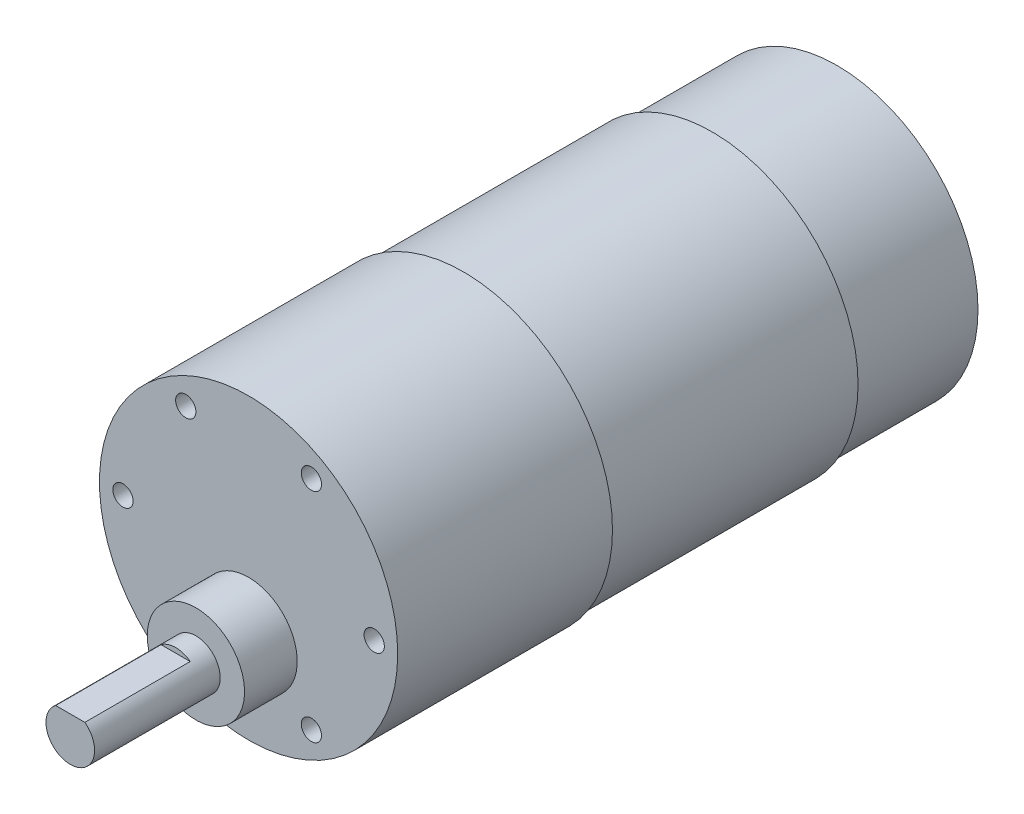
ISO-10303-21;
HEADER;
FILE_DESCRIPTION(('STEP AP214'),'2;1');
FILE_NAME('part.step','',(''),(''),'','','');
FILE_SCHEMA(('AUTOMOTIVE_DESIGN { 1 0 10303 214 1 1 1 1 }'));
ENDSEC;
DATA;
#1=APPLICATION_CONTEXT('core data for automotive mechanical design processes');
#2=APPLICATION_PROTOCOL_DEFINITION('international standard','automotive_design',2000,#1);
#3=PRODUCT_CONTEXT('',#1,'mechanical');
#4=PRODUCT('Part','Part','',(#3));
#5=PRODUCT_RELATED_PRODUCT_CATEGORY('part','',(#4));
#6=PRODUCT_DEFINITION_FORMATION('','',#4);
#7=PRODUCT_DEFINITION_CONTEXT('part definition',#1,'design');
#8=PRODUCT_DEFINITION('design','',#6,#7);
#9=PRODUCT_DEFINITION_SHAPE('','',#8);
#10=(LENGTH_UNIT() NAMED_UNIT(*) SI_UNIT(.MILLI.,.METRE.));
#11=(NAMED_UNIT(*) PLANE_ANGLE_UNIT() SI_UNIT($,.RADIAN.));
#12=(NAMED_UNIT(*) SI_UNIT($,.STERADIAN.) SOLID_ANGLE_UNIT());
#13=UNCERTAINTY_MEASURE_WITH_UNIT(LENGTH_MEASURE(1.E-05),#10,'distance_accuracy_value','');
#14=(GEOMETRIC_REPRESENTATION_CONTEXT(3) GLOBAL_UNCERTAINTY_ASSIGNED_CONTEXT((#13)) GLOBAL_UNIT_ASSIGNED_CONTEXT((#10,
#11,#12)) REPRESENTATION_CONTEXT('',''));
#15=CARTESIAN_POINT('',(0.,0.,0.));
#16=DIRECTION('',(0.,0.,1.));
#17=DIRECTION('',(1.,0.,0.));
#18=AXIS2_PLACEMENT_3D('',#15,#16,#17);
#19=CARTESIAN_POINT('',(0.,0.,15.4));
#20=DIRECTION('',(0.,0.,-1.));
#21=DIRECTION('',(-1.,0.,0.));
#22=AXIS2_PLACEMENT_3D('',#19,#20,#21);
#23=CYLINDRICAL_SURFACE('',#22,17.4);
#24=CARTESIAN_POINT('',(0.,0.,15.4));
#25=DIRECTION('',(0.,0.,1.));
#26=DIRECTION('',(1.,0.,0.));
#27=AXIS2_PLACEMENT_3D('',#24,#25,#26);
#28=CIRCLE('',#27,17.4);
#29=CARTESIAN_POINT('',(-17.4,0.,15.4));
#30=VERTEX_POINT('',#29);
#31=EDGE_CURVE('E11',#30,#30,#28,.T.);
#32=CARTESIAN_POINT('',(0.,0.,0.));
#33=DIRECTION('',(0.,0.,1.));
#34=DIRECTION('',(1.,0.,0.));
#35=AXIS2_PLACEMENT_3D('',#32,#33,#34);
#36=CIRCLE('',#35,17.4);
#37=CARTESIAN_POINT('',(-17.4,0.,0.));
#38=VERTEX_POINT('',#37);
#39=EDGE_CURVE('E45',#38,#38,#36,.T.);
#40=CARTESIAN_POINT('',(-17.4,0.,15.4));
#41=CARTESIAN_POINT('',(-17.4,0.,15.2395833333333));
#42=CARTESIAN_POINT('',(-17.4,0.,15.0791666666667));
#43=CARTESIAN_POINT('',(-17.4,0.,14.7583333333333));
#44=CARTESIAN_POINT('',(-17.4,0.,14.5979166666667));
#45=CARTESIAN_POINT('',(-17.4,0.,14.2770833333333));
#46=CARTESIAN_POINT('',(-17.4,0.,14.1166666666667));
#47=CARTESIAN_POINT('',(-17.4,0.,13.7958333333333));
#48=CARTESIAN_POINT('',(-17.4,0.,13.6354166666667));
#49=CARTESIAN_POINT('',(-17.4,0.,13.3145833333333));
#50=CARTESIAN_POINT('',(-17.4,0.,13.1541666666667));
#51=CARTESIAN_POINT('',(-17.4,0.,12.8333333333333));
#52=CARTESIAN_POINT('',(-17.4,0.,12.6729166666667));
#53=CARTESIAN_POINT('',(-17.4,0.,12.3520833333333));
#54=CARTESIAN_POINT('',(-17.4,0.,12.1916666666667));
#55=CARTESIAN_POINT('',(-17.4,0.,11.8708333333333));
#56=CARTESIAN_POINT('',(-17.4,0.,11.7104166666667));
#57=CARTESIAN_POINT('',(-17.4,0.,11.3895833333333));
#58=CARTESIAN_POINT('',(-17.4,0.,11.2291666666667));
#59=CARTESIAN_POINT('',(-17.4,0.,10.9083333333333));
#60=CARTESIAN_POINT('',(-17.4,0.,10.7479166666667));
#61=CARTESIAN_POINT('',(-17.4,0.,10.4270833333333));
#62=CARTESIAN_POINT('',(-17.4,0.,10.2666666666667));
#63=CARTESIAN_POINT('',(-17.4,0.,9.94583333333333));
#64=CARTESIAN_POINT('',(-17.4,0.,9.78541666666666));
#65=CARTESIAN_POINT('',(-17.4,0.,9.46458333333333));
#66=CARTESIAN_POINT('',(-17.4,0.,9.30416666666667));
#67=CARTESIAN_POINT('',(-17.4,0.,8.98333333333333));
#68=CARTESIAN_POINT('',(-17.4,0.,8.82291666666666));
#69=CARTESIAN_POINT('',(-17.4,0.,8.50208333333333));
#70=CARTESIAN_POINT('',(-17.4,0.,8.34166666666666));
#71=CARTESIAN_POINT('',(-17.4,0.,8.02083333333333));
#72=CARTESIAN_POINT('',(-17.4,0.,7.86041666666666));
#73=CARTESIAN_POINT('',(-17.4,0.,7.53958333333333));
#74=CARTESIAN_POINT('',(-17.4,0.,7.37916666666667));
#75=CARTESIAN_POINT('',(-17.4,0.,7.05833333333333));
#76=CARTESIAN_POINT('',(-17.4,0.,6.89791666666667));
#77=CARTESIAN_POINT('',(-17.4,0.,6.57708333333333));
#78=CARTESIAN_POINT('',(-17.4,0.,6.41666666666667));
#79=CARTESIAN_POINT('',(-17.4,0.,6.09583333333333));
#80=CARTESIAN_POINT('',(-17.4,0.,5.93541666666667));
#81=CARTESIAN_POINT('',(-17.4,0.,5.61458333333333));
#82=CARTESIAN_POINT('',(-17.4,0.,5.45416666666667));
#83=CARTESIAN_POINT('',(-17.4,0.,5.13333333333333));
#84=CARTESIAN_POINT('',(-17.4,0.,4.97291666666667));
#85=CARTESIAN_POINT('',(-17.4,0.,4.65208333333333));
#86=CARTESIAN_POINT('',(-17.4,0.,4.49166666666667));
#87=CARTESIAN_POINT('',(-17.4,0.,4.17083333333333));
#88=CARTESIAN_POINT('',(-17.4,0.,4.01041666666667));
#89=CARTESIAN_POINT('',(-17.4,0.,3.68958333333333));
#90=CARTESIAN_POINT('',(-17.4,0.,3.52916666666667));
#91=CARTESIAN_POINT('',(-17.4,0.,3.20833333333333));
#92=CARTESIAN_POINT('',(-17.4,0.,3.04791666666667));
#93=CARTESIAN_POINT('',(-17.4,0.,2.72708333333333));
#94=CARTESIAN_POINT('',(-17.4,0.,2.56666666666667));
#95=CARTESIAN_POINT('',(-17.4,0.,2.24583333333333));
#96=CARTESIAN_POINT('',(-17.4,0.,2.08541666666666));
#97=CARTESIAN_POINT('',(-17.4,0.,1.76458333333333));
#98=CARTESIAN_POINT('',(-17.4,0.,1.60416666666667));
#99=CARTESIAN_POINT('',(-17.4,0.,1.28333333333333));
#100=CARTESIAN_POINT('',(-17.4,0.,1.12291666666666));
#101=CARTESIAN_POINT('',(-17.4,0.,0.802083333333332));
#102=CARTESIAN_POINT('',(-17.4,0.,0.641666666666665));
#103=CARTESIAN_POINT('',(-17.4,0.,0.320833333333332));
#104=CARTESIAN_POINT('',(-17.4,0.,0.160416666666665));
#105=CARTESIAN_POINT('',(-17.4,0.,0.));
#106=B_SPLINE_CURVE_WITH_KNOTS('',3,(#40,#41,#42,#43,#44,#45,#46,#47,#48,#49,#50,#51,#52,#53,
#54,#55,#56,#57,#58,#59,#60,#61,#62,#63,#64,#65,#66,#67,#68,#69,#70,#71,#72,#73,#74,#75,#76,#77,
#78,#79,#80,#81,#82,#83,#84,#85,#86,#87,#88,#89,#90,#91,#92,#93,#94,#95,#96,#97,#98,#99,#100,
#101,#102,#103,#104,#105),.UNSPECIFIED.,.F.,.F.,(4,2,2,2,2,2,2,2,2,2,2,2,2,2,2,2,2,2,2,2,2,2,2,
2,2,2,2,2,2,2,2,2,4),(0.,0.481250000000001,0.962500000000002,1.44375,1.925,2.40625,2.8875,
3.36875,3.85,4.33125,4.8125,5.29375,5.775,6.25625,6.7375,7.21875,7.7,8.18125,8.6625,9.14375,
9.625,10.10625,10.5875,11.06875,11.55,12.03125,12.5125,12.99375,13.475,13.95625,14.4375,
14.91875,15.4),.UNSPECIFIED.);
#107=EDGE_CURVE('BSEAM42',#30,#38,#106,.T.);
#108=ORIENTED_EDGE('',*,*,#31,.F.);
#109=ORIENTED_EDGE('',*,*,#39,.T.);
#110=ORIENTED_EDGE('',*,*,#107,.T.);
#111=ORIENTED_EDGE('',*,*,#107,.F.);
#112=EDGE_LOOP('',(#108,#110,#109,#111));
#113=FACE_BOUND('',#112,.T.);
#114=ADVANCED_FACE('F42',(#113),#23,.T.);
#115=CARTESIAN_POINT('',(0.,0.,0.));
#116=DIRECTION('',(0.,0.,1.));
#117=DIRECTION('',(1.,0.,0.));
#118=AXIS2_PLACEMENT_3D('',#115,#116,#117);
#119=PLANE('',#118);
#120=ORIENTED_EDGE('',*,*,#39,.F.);
#121=EDGE_LOOP('',(#120));
#122=FACE_BOUND('',#121,.T.);
#123=ADVANCED_FACE('F138',(#122),#119,.F.);
#124=CARTESIAN_POINT('',(0.,0.,46.1));
#125=DIRECTION('',(0.,0.,-1.));
#126=DIRECTION('',(-1.,0.,0.));
#127=AXIS2_PLACEMENT_3D('',#124,#125,#126);
#128=CYLINDRICAL_SURFACE('',#127,18.);
#129=CARTESIAN_POINT('',(0.,0.,46.1));
#130=DIRECTION('',(0.,0.,1.));
#131=DIRECTION('',(1.,0.,0.));
#132=AXIS2_PLACEMENT_3D('',#129,#130,#131);
#133=CIRCLE('',#132,18.);
#134=CARTESIAN_POINT('',(18.,0.,46.1));
#135=VERTEX_POINT('',#134);
#136=EDGE_CURVE('E115',#135,#135,#133,.T.);
#137=ORIENTED_EDGE('',*,*,#136,.F.);
#138=EDGE_LOOP('',(#137));
#139=FACE_BOUND('',#138,.T.);
#140=CARTESIAN_POINT('',(0.,0.,15.4));
#141=DIRECTION('',(0.,0.,1.));
#142=DIRECTION('',(1.,0.,0.));
#143=AXIS2_PLACEMENT_3D('',#140,#141,#142);
#144=CIRCLE('',#143,18.);
#145=CARTESIAN_POINT('',(18.,0.,15.4));
#146=VERTEX_POINT('',#145);
#147=EDGE_CURVE('E111',#146,#146,#144,.T.);
#148=ORIENTED_EDGE('',*,*,#147,.T.);
#149=EDGE_LOOP('',(#148));
#150=FACE_BOUND('',#149,.T.);
#151=ADVANCED_FACE('F124',(#139,#150),#128,.T.);
#152=CARTESIAN_POINT('',(0.,0.,15.4));
#153=DIRECTION('',(0.,0.,1.));
#154=DIRECTION('',(1.,0.,0.));
#155=AXIS2_PLACEMENT_3D('',#152,#153,#154);
#156=PLANE('',#155);
#157=ORIENTED_EDGE('',*,*,#31,.T.);
#158=EDGE_LOOP('',(#157));
#159=FACE_BOUND('',#158,.T.);
#160=ORIENTED_EDGE('',*,*,#147,.F.);
#161=EDGE_LOOP('',(#160));
#162=FACE_BOUND('',#161,.T.);
#163=ADVANCED_FACE('F126',(#159,#162),#156,.F.);
#164=CARTESIAN_POINT('',(0.,0.,72.6));
#165=DIRECTION('',(0.,0.,-1.));
#166=DIRECTION('',(-1.,0.,0.));
#167=AXIS2_PLACEMENT_3D('',#164,#165,#166);
#168=CYLINDRICAL_SURFACE('',#167,18.4);
#169=CARTESIAN_POINT('',(0.,0.,72.6));
#170=DIRECTION('',(0.,0.,1.));
#171=DIRECTION('',(1.,0.,0.));
#172=AXIS2_PLACEMENT_3D('',#169,#170,#171);
#173=CIRCLE('',#172,18.4);
#174=CARTESIAN_POINT('',(18.4,0.,72.6));
#175=VERTEX_POINT('',#174);
#176=EDGE_CURVE('E107',#175,#175,#173,.T.);
#177=ORIENTED_EDGE('',*,*,#176,.F.);
#178=EDGE_LOOP('',(#177));
#179=FACE_BOUND('',#178,.T.);
#180=CARTESIAN_POINT('',(0.,0.,46.1));
#181=DIRECTION('',(0.,0.,1.));
#182=DIRECTION('',(1.,0.,0.));
#183=AXIS2_PLACEMENT_3D('',#180,#181,#182);
#184=CIRCLE('',#183,18.4);
#185=CARTESIAN_POINT('',(18.4,0.,46.1));
#186=VERTEX_POINT('',#185);
#187=EDGE_CURVE('E105',#186,#186,#184,.T.);
#188=ORIENTED_EDGE('',*,*,#187,.T.);
#189=EDGE_LOOP('',(#188));
#190=FACE_BOUND('',#189,.T.);
#191=ADVANCED_FACE('F128',(#179,#190),#168,.T.);
#192=CARTESIAN_POINT('',(0.,0.,72.6));
#193=DIRECTION('',(0.,0.,1.));
#194=DIRECTION('',(1.,0.,0.));
#195=AXIS2_PLACEMENT_3D('',#192,#193,#194);
#196=PLANE('',#195);
#197=CARTESIAN_POINT('',(-15.5,0.,72.6));
#198=DIRECTION('',(0.,0.,1.));
#199=DIRECTION('',(1.,0.,0.));
#200=AXIS2_PLACEMENT_3D('',#197,#198,#199);
#201=CIRCLE('',#200,1.25);
#202=CARTESIAN_POINT('',(-14.25,0.,72.6));
#203=VERTEX_POINT('',#202);
#204=EDGE_CURVE('E166',#203,#203,#201,.T.);
#205=ORIENTED_EDGE('',*,*,#204,.F.);
#206=EDGE_LOOP('',(#205));
#207=FACE_BOUND('',#206,.T.);
#208=CARTESIAN_POINT('',(-7.74999999999997,13.4233937586588,72.6));
#209=DIRECTION('',(0.,0.,1.));
#210=DIRECTION('',(1.,0.,0.));
#211=AXIS2_PLACEMENT_3D('',#208,#209,#210);
#212=CIRCLE('',#211,1.25);
#213=CARTESIAN_POINT('',(-6.49999999999997,13.4233937586588,72.6));
#214=VERTEX_POINT('',#213);
#215=EDGE_CURVE('E153',#214,#214,#212,.T.);
#216=ORIENTED_EDGE('',*,*,#215,.F.);
#217=EDGE_LOOP('',(#216));
#218=FACE_BOUND('',#217,.T.);
#219=CARTESIAN_POINT('',(7.75000000000006,13.4233937586588,72.6));
#220=DIRECTION('',(0.,0.,1.));
#221=DIRECTION('',(1.,0.,0.));
#222=AXIS2_PLACEMENT_3D('',#219,#220,#221);
#223=CIRCLE('',#222,1.25);
#224=CARTESIAN_POINT('',(9.00000000000006,13.4233937586588,72.6));
#225=VERTEX_POINT('',#224);
#226=EDGE_CURVE('E162',#225,#225,#223,.T.);
#227=ORIENTED_EDGE('',*,*,#226,.F.);
#228=EDGE_LOOP('',(#227));
#229=FACE_BOUND('',#228,.T.);
#230=CARTESIAN_POINT('',(15.5,-1.08235921504137E-13,72.6));
#231=DIRECTION('',(0.,0.,1.));
#232=DIRECTION('',(1.,0.,0.));
#233=AXIS2_PLACEMENT_3D('',#230,#231,#232);
#234=CIRCLE('',#233,1.25);
#235=CARTESIAN_POINT('',(16.75,-1.08235921504137E-13,72.6));
#236=VERTEX_POINT('',#235);
#237=EDGE_CURVE('E176',#236,#236,#234,.T.);
#238=ORIENTED_EDGE('',*,*,#237,.F.);
#239=EDGE_LOOP('',(#238));
#240=FACE_BOUND('',#239,.T.);
#241=CARTESIAN_POINT('',(7.74999999999987,-13.4233937586589,72.6));
#242=DIRECTION('',(0.,0.,1.));
#243=DIRECTION('',(1.,0.,0.));
#244=AXIS2_PLACEMENT_3D('',#241,#242,#243);
#245=CIRCLE('',#244,1.25);
#246=CARTESIAN_POINT('',(8.99999999999987,-13.4233937586589,72.6));
#247=VERTEX_POINT('',#246);
#248=EDGE_CURVE('E184',#247,#247,#245,.T.);
#249=ORIENTED_EDGE('',*,*,#248,.F.);
#250=EDGE_LOOP('',(#249));
#251=FACE_BOUND('',#250,.T.);
#252=CARTESIAN_POINT('',(-7.75000000000016,-13.4233937586587,72.6));
#253=DIRECTION('',(0.,0.,1.));
#254=DIRECTION('',(1.,0.,0.));
#255=AXIS2_PLACEMENT_3D('',#252,#253,#254);
#256=CIRCLE('',#255,1.25);
#257=CARTESIAN_POINT('',(-6.50000000000016,-13.4233937586587,72.6));
#258=VERTEX_POINT('',#257);
#259=EDGE_CURVE('E192',#258,#258,#256,.T.);
#260=ORIENTED_EDGE('',*,*,#259,.F.);
#261=EDGE_LOOP('',(#260));
#262=FACE_BOUND('',#261,.T.);
#263=CARTESIAN_POINT('',(0.,-7.,72.6));
#264=DIRECTION('',(0.,0.,1.));
#265=DIRECTION('',(1.,0.,0.));
#266=AXIS2_PLACEMENT_3D('',#263,#264,#265);
#267=CIRCLE('',#266,6.);
#268=CARTESIAN_POINT('',(-6.,-7.,72.6));
#269=VERTEX_POINT('',#268);
#270=EDGE_CURVE('E91',#269,#269,#267,.T.);
#271=ORIENTED_EDGE('',*,*,#270,.F.);
#272=EDGE_LOOP('',(#271));
#273=FACE_BOUND('',#272,.T.);
#274=ORIENTED_EDGE('',*,*,#176,.T.);
#275=EDGE_LOOP('',(#274));
#276=FACE_BOUND('',#275,.T.);
#277=ADVANCED_FACE('F135',(#207,#218,#229,#240,#251,#262,#273,#276),#196,.T.);
#278=CARTESIAN_POINT('',(0.,0.,46.1));
#279=DIRECTION('',(0.,0.,1.));
#280=DIRECTION('',(1.,0.,0.));
#281=AXIS2_PLACEMENT_3D('',#278,#279,#280);
#282=PLANE('',#281);
#283=ORIENTED_EDGE('',*,*,#136,.T.);
#284=EDGE_LOOP('',(#283));
#285=FACE_BOUND('',#284,.T.);
#286=ORIENTED_EDGE('',*,*,#187,.F.);
#287=EDGE_LOOP('',(#286));
#288=FACE_BOUND('',#287,.T.);
#289=ADVANCED_FACE('F229',(#285,#288),#282,.F.);
#290=CARTESIAN_POINT('',(0.,-7.,79.1));
#291=DIRECTION('',(0.,0.,-1.));
#292=DIRECTION('',(-1.,0.,0.));
#293=AXIS2_PLACEMENT_3D('',#290,#291,#292);
#294=CYLINDRICAL_SURFACE('',#293,6.);
#295=CARTESIAN_POINT('',(0.,-7.,79.1));
#296=DIRECTION('',(0.,0.,1.));
#297=DIRECTION('',(1.,0.,0.));
#298=AXIS2_PLACEMENT_3D('',#295,#296,#297);
#299=CIRCLE('',#298,6.);
#300=CARTESIAN_POINT('',(-6.,-7.,79.1));
#301=VERTEX_POINT('',#300);
#302=EDGE_CURVE('E96',#301,#301,#299,.T.);
#303=CARTESIAN_POINT('',(-6.,-7.,79.1));
#304=CARTESIAN_POINT('',(-6.,-7.,79.0322916666667));
#305=CARTESIAN_POINT('',(-6.,-7.,78.9645833333333));
#306=CARTESIAN_POINT('',(-6.,-7.,78.8291666666667));
#307=CARTESIAN_POINT('',(-6.,-7.,78.7614583333333));
#308=CARTESIAN_POINT('',(-6.,-7.,78.6260416666667));
#309=CARTESIAN_POINT('',(-6.,-7.,78.5583333333333));
#310=CARTESIAN_POINT('',(-6.,-7.,78.4229166666667));
#311=CARTESIAN_POINT('',(-6.,-7.,78.3552083333333));
#312=CARTESIAN_POINT('',(-6.,-7.,78.2197916666667));
#313=CARTESIAN_POINT('',(-6.,-7.,78.1520833333333));
#314=CARTESIAN_POINT('',(-6.,-7.,78.0166666666667));
#315=CARTESIAN_POINT('',(-6.,-7.,77.9489583333333));
#316=CARTESIAN_POINT('',(-6.,-7.,77.8135416666667));
#317=CARTESIAN_POINT('',(-6.,-7.,77.7458333333333));
#318=CARTESIAN_POINT('',(-6.,-7.,77.6104166666667));
#319=CARTESIAN_POINT('',(-6.,-7.,77.5427083333333));
#320=CARTESIAN_POINT('',(-6.,-7.,77.4072916666667));
#321=CARTESIAN_POINT('',(-6.,-7.,77.3395833333333));
#322=CARTESIAN_POINT('',(-6.,-7.,77.2041666666667));
#323=CARTESIAN_POINT('',(-6.,-7.,77.1364583333333));
#324=CARTESIAN_POINT('',(-6.,-7.,77.0010416666667));
#325=CARTESIAN_POINT('',(-6.,-7.,76.9333333333333));
#326=CARTESIAN_POINT('',(-6.,-7.,76.7979166666667));
#327=CARTESIAN_POINT('',(-6.,-7.,76.7302083333333));
#328=CARTESIAN_POINT('',(-6.,-7.,76.5947916666667));
#329=CARTESIAN_POINT('',(-6.,-7.,76.5270833333333));
#330=CARTESIAN_POINT('',(-6.,-7.,76.3916666666667));
#331=CARTESIAN_POINT('',(-6.,-7.,76.3239583333333));
#332=CARTESIAN_POINT('',(-6.,-7.,76.1885416666667));
#333=CARTESIAN_POINT('',(-6.,-7.,76.1208333333333));
#334=CARTESIAN_POINT('',(-6.,-7.,75.9854166666667));
#335=CARTESIAN_POINT('',(-6.,-7.,75.9177083333333));
#336=CARTESIAN_POINT('',(-6.,-7.,75.7822916666667));
#337=CARTESIAN_POINT('',(-6.,-7.,75.7145833333333));
#338=CARTESIAN_POINT('',(-6.,-7.,75.5791666666667));
#339=CARTESIAN_POINT('',(-6.,-7.,75.5114583333333));
#340=CARTESIAN_POINT('',(-6.,-7.,75.3760416666667));
#341=CARTESIAN_POINT('',(-6.,-7.,75.3083333333333));
#342=CARTESIAN_POINT('',(-6.,-7.,75.1729166666667));
#343=CARTESIAN_POINT('',(-6.,-7.,75.1052083333333));
#344=CARTESIAN_POINT('',(-6.,-7.,74.9697916666667));
#345=CARTESIAN_POINT('',(-6.,-7.,74.9020833333333));
#346=CARTESIAN_POINT('',(-6.,-7.,74.7666666666667));
#347=CARTESIAN_POINT('',(-6.,-7.,74.6989583333333));
#348=CARTESIAN_POINT('',(-6.,-7.,74.5635416666667));
#349=CARTESIAN_POINT('',(-6.,-7.,74.4958333333333));
#350=CARTESIAN_POINT('',(-6.,-7.,74.3604166666667));
#351=CARTESIAN_POINT('',(-6.,-7.,74.2927083333333));
#352=CARTESIAN_POINT('',(-6.,-7.,74.1572916666667));
#353=CARTESIAN_POINT('',(-6.,-7.,74.0895833333333));
#354=CARTESIAN_POINT('',(-6.,-7.,73.9541666666667));
#355=CARTESIAN_POINT('',(-6.,-7.,73.8864583333333));
#356=CARTESIAN_POINT('',(-6.,-7.,73.7510416666667));
#357=CARTESIAN_POINT('',(-6.,-7.,73.6833333333333));
#358=CARTESIAN_POINT('',(-6.,-7.,73.5479166666667));
#359=CARTESIAN_POINT('',(-6.,-7.,73.4802083333333));
#360=CARTESIAN_POINT('',(-6.,-7.,73.3447916666667));
#361=CARTESIAN_POINT('',(-6.,-7.,73.2770833333333));
#362=CARTESIAN_POINT('',(-6.,-7.,73.1416666666667));
#363=CARTESIAN_POINT('',(-6.,-7.,73.0739583333333));
#364=CARTESIAN_POINT('',(-6.,-7.,72.9385416666667));
#365=CARTESIAN_POINT('',(-6.,-7.,72.8708333333333));
#366=CARTESIAN_POINT('',(-6.,-7.,72.7354166666667));
#367=CARTESIAN_POINT('',(-6.,-7.,72.6677083333333));
#368=CARTESIAN_POINT('',(-6.,-7.,72.6));
#369=B_SPLINE_CURVE_WITH_KNOTS('',3,(#303,#304,#305,#306,#307,#308,#309,#310,#311,#312,#313,
#314,#315,#316,#317,#318,#319,#320,#321,#322,#323,#324,#325,#326,#327,#328,#329,#330,#331,#332,
#333,#334,#335,#336,#337,#338,#339,#340,#341,#342,#343,#344,#345,#346,#347,#348,#349,#350,#351,
#352,#353,#354,#355,#356,#357,#358,#359,#360,#361,#362,#363,#364,#365,#366,#367,#368),
.UNSPECIFIED.,.F.,.F.,(4,2,2,2,2,2,2,2,2,2,2,2,2,2,2,2,2,2,2,2,2,2,2,2,2,2,2,2,2,2,2,2,4),(0.,
0.203124999999998,0.406249999999997,0.609374999999995,0.812499999999994,1.01562499999999,
1.21874999999999,1.42187499999999,1.625,1.828125,2.03125,2.234375,2.4375,2.64062499999999,
2.84374999999999,3.04687499999999,3.25,3.453125,3.65625,3.859375,4.0625,4.26562499999999,
4.46874999999999,4.67187499999999,4.875,5.078125,5.28125,5.484375,5.6875,5.890625,
6.09374999999999,6.29687499999999,6.50000000000001),.UNSPECIFIED.);
#370=EDGE_CURVE('BSEAM225',#301,#269,#369,.T.);
#371=ORIENTED_EDGE('',*,*,#302,.F.);
#372=ORIENTED_EDGE('',*,*,#270,.T.);
#373=ORIENTED_EDGE('',*,*,#370,.T.);
#374=ORIENTED_EDGE('',*,*,#370,.F.);
#375=EDGE_LOOP('',(#371,#373,#372,#374));
#376=FACE_BOUND('',#375,.T.);
#377=ADVANCED_FACE('F225',(#376),#294,.T.);
#378=CARTESIAN_POINT('',(0.,-7.,79.1));
#379=DIRECTION('',(0.,0.,1.));
#380=DIRECTION('',(1.,0.,0.));
#381=AXIS2_PLACEMENT_3D('',#378,#379,#380);
#382=PLANE('',#381);
#383=CARTESIAN_POINT('',(0.,-7.,79.1));
#384=DIRECTION('',(0.,0.,1.));
#385=DIRECTION('',(1.,0.,0.));
#386=AXIS2_PLACEMENT_3D('',#383,#384,#385);
#387=CIRCLE('',#386,3.);
#388=CARTESIAN_POINT('',(3.,-7.,79.1));
#389=VERTEX_POINT('',#388);
#390=EDGE_CURVE('E87',#389,#389,#387,.T.);
#391=ORIENTED_EDGE('',*,*,#390,.F.);
#392=EDGE_LOOP('',(#391));
#393=FACE_BOUND('',#392,.T.);
#394=ORIENTED_EDGE('',*,*,#302,.T.);
#395=EDGE_LOOP('',(#394));
#396=FACE_BOUND('',#395,.T.);
#397=ADVANCED_FACE('F222',(#393,#396),#382,.T.);
#398=CARTESIAN_POINT('',(0.,-7.,94.6));
#399=DIRECTION('',(0.,0.,-1.));
#400=DIRECTION('',(-1.,0.,0.));
#401=AXIS2_PLACEMENT_3D('',#398,#399,#400);
#402=CYLINDRICAL_SURFACE('',#401,3.);
#403=CARTESIAN_POINT('',(0.,-7.,94.6));
#404=DIRECTION('',(0.,0.,1.));
#405=DIRECTION('',(1.,0.,0.));
#406=AXIS2_PLACEMENT_3D('',#403,#404,#405);
#407=CIRCLE('',#406,3.);
#408=CARTESIAN_POINT('',(-1.8,-4.6,94.6));
#409=VERTEX_POINT('',#408);
#410=CARTESIAN_POINT('',(1.8,-4.6,94.6));
#411=VERTEX_POINT('',#410);
#412=EDGE_CURVE('E85',#409,#411,#407,.T.);
#413=ORIENTED_EDGE('',*,*,#412,.F.);
#414=DIRECTION('',(0.,0.,1.));
#415=VECTOR('',#414,1.);
#416=CARTESIAN_POINT('',(-1.8,-4.6,81.6));
#417=LINE('',#416,#415);
#418=CARTESIAN_POINT('',(-1.8,-4.6,81.6));
#419=VERTEX_POINT('',#418);
#420=EDGE_CURVE('E60',#419,#409,#417,.T.);
#421=ORIENTED_EDGE('',*,*,#420,.F.);
#422=CARTESIAN_POINT('',(0.,-7.00000000000001,81.6));
#423=DIRECTION('',(0.,0.,1.));
#424=DIRECTION('',(-1.,0.,0.));
#425=AXIS2_PLACEMENT_3D('',#422,#423,#424);
#426=CIRCLE('',#425,3.00000000000001);
#427=CARTESIAN_POINT('',(1.8,-4.6,81.6));
#428=VERTEX_POINT('',#427);
#429=EDGE_CURVE('E78',#428,#419,#426,.T.);
#430=ORIENTED_EDGE('',*,*,#429,.F.);
#431=DIRECTION('',(0.,0.,1.));
#432=VECTOR('',#431,1.);
#433=CARTESIAN_POINT('',(1.8,-4.6,81.6));
#434=LINE('',#433,#432);
#435=EDGE_CURVE('E66',#428,#411,#434,.T.);
#436=ORIENTED_EDGE('',*,*,#435,.T.);
#437=EDGE_LOOP('',(#413,#421,#430,#436));
#438=FACE_BOUND('',#437,.T.);
#439=ORIENTED_EDGE('',*,*,#390,.T.);
#440=EDGE_LOOP('',(#439));
#441=FACE_BOUND('',#440,.T.);
#442=ADVANCED_FACE('F83',(#438,#441),#402,.T.);
#443=CARTESIAN_POINT('',(0.,-7.,94.6));
#444=DIRECTION('',(0.,0.,1.));
#445=DIRECTION('',(1.,0.,0.));
#446=AXIS2_PLACEMENT_3D('',#443,#444,#445);
#447=PLANE('',#446);
#448=DIRECTION('',(1.,0.,0.));
#449=VECTOR('',#448,1.);
#450=CARTESIAN_POINT('',(-1.8,-4.6,94.6));
#451=LINE('',#450,#449);
#452=EDGE_CURVE('E72',#409,#411,#451,.T.);
#453=ORIENTED_EDGE('',*,*,#452,.F.);
#454=ORIENTED_EDGE('',*,*,#412,.T.);
#455=EDGE_LOOP('',(#453,#454));
#456=FACE_BOUND('',#455,.T.);
#457=ADVANCED_FACE('F89',(#456),#447,.T.);
#458=CARTESIAN_POINT('',(-1.8,-4.6,81.6));
#459=DIRECTION('',(0.,-1.,0.));
#460=DIRECTION('',(0.,0.,-1.));
#461=AXIS2_PLACEMENT_3D('',#458,#459,#460);
#462=PLANE('',#461);
#463=ORIENTED_EDGE('',*,*,#452,.T.);
#464=ORIENTED_EDGE('',*,*,#435,.F.);
#465=DIRECTION('',(1.,0.,0.));
#466=VECTOR('',#465,1.);
#467=CARTESIAN_POINT('',(-1.8,-4.6,81.6));
#468=LINE('',#467,#466);
#469=EDGE_CURVE('E200',#419,#428,#468,.T.);
#470=ORIENTED_EDGE('',*,*,#469,.F.);
#471=ORIENTED_EDGE('',*,*,#420,.T.);
#472=EDGE_LOOP('',(#463,#464,#470,#471));
#473=FACE_BOUND('',#472,.T.);
#474=ADVANCED_FACE('F73',(#473),#462,.F.);
#475=CARTESIAN_POINT('',(0.,-7.00000000000001,81.6));
#476=DIRECTION('',(0.,0.,-1.));
#477=DIRECTION('',(-1.,0.,0.));
#478=AXIS2_PLACEMENT_3D('',#475,#476,#477);
#479=PLANE('',#478);
#480=ORIENTED_EDGE('',*,*,#429,.T.);
#481=ORIENTED_EDGE('',*,*,#469,.T.);
#482=EDGE_LOOP('',(#480,#481));
#483=FACE_BOUND('',#482,.T.);
#484=ADVANCED_FACE('F204',(#483),#479,.F.);
#485=CARTESIAN_POINT('',(-7.75000000000016,-13.4233937586587,61.84));
#486=DIRECTION('',(0.,0.,-1.));
#487=DIRECTION('',(-1.,0.,0.));
#488=AXIS2_PLACEMENT_3D('',#485,#486,#487);
#489=PLANE('',#488);
#490=CARTESIAN_POINT('',(-7.75000000000016,-13.4233937586587,61.84));
#491=DIRECTION('',(0.,0.,1.));
#492=DIRECTION('',(1.,0.,0.));
#493=AXIS2_PLACEMENT_3D('',#490,#491,#492);
#494=CIRCLE('',#493,1.25);
#495=CARTESIAN_POINT('',(-6.50000000000016,-13.4233937586587,61.84));
#496=VERTEX_POINT('',#495);
#497=EDGE_CURVE('E79',#496,#496,#494,.T.);
#498=ORIENTED_EDGE('',*,*,#497,.T.);
#499=EDGE_LOOP('',(#498));
#500=FACE_BOUND('',#499,.T.);
#501=ADVANCED_FACE('F206',(#500),#489,.F.);
#502=CARTESIAN_POINT('',(-7.75000000000016,-13.4233937586587,72.6));
#503=DIRECTION('',(0.,0.,1.));
#504=DIRECTION('',(1.,0.,0.));
#505=AXIS2_PLACEMENT_3D('',#502,#503,#504);
#506=CYLINDRICAL_SURFACE('',#505,1.25);
#507=ORIENTED_EDGE('',*,*,#497,.F.);
#508=EDGE_LOOP('',(#507));
#509=FACE_BOUND('',#508,.T.);
#510=ORIENTED_EDGE('',*,*,#259,.T.);
#511=EDGE_LOOP('',(#510));
#512=FACE_BOUND('',#511,.T.);
#513=ADVANCED_FACE('F212',(#509,#512),#506,.F.);
#514=CARTESIAN_POINT('',(7.74999999999987,-13.4233937586589,61.84));
#515=DIRECTION('',(0.,0.,-1.));
#516=DIRECTION('',(-1.,0.,0.));
#517=AXIS2_PLACEMENT_3D('',#514,#515,#516);
#518=PLANE('',#517);
#519=CARTESIAN_POINT('',(7.74999999999987,-13.4233937586589,61.84));
#520=DIRECTION('',(0.,0.,1.));
#521=DIRECTION('',(1.,0.,0.));
#522=AXIS2_PLACEMENT_3D('',#519,#520,#521);
#523=CIRCLE('',#522,1.25);
#524=CARTESIAN_POINT('',(8.99999999999987,-13.4233937586589,61.84));
#525=VERTEX_POINT('',#524);
#526=EDGE_CURVE('E188',#525,#525,#523,.T.);
#527=ORIENTED_EDGE('',*,*,#526,.T.);
#528=EDGE_LOOP('',(#527));
#529=FACE_BOUND('',#528,.T.);
#530=ADVANCED_FACE('F285',(#529),#518,.F.);
#531=CARTESIAN_POINT('',(7.74999999999987,-13.4233937586589,72.6));
#532=DIRECTION('',(0.,0.,1.));
#533=DIRECTION('',(1.,0.,0.));
#534=AXIS2_PLACEMENT_3D('',#531,#532,#533);
#535=CYLINDRICAL_SURFACE('',#534,1.25);
#536=ORIENTED_EDGE('',*,*,#526,.F.);
#537=EDGE_LOOP('',(#536));
#538=FACE_BOUND('',#537,.T.);
#539=ORIENTED_EDGE('',*,*,#248,.T.);
#540=EDGE_LOOP('',(#539));
#541=FACE_BOUND('',#540,.T.);
#542=ADVANCED_FACE('F292',(#538,#541),#535,.F.);
#543=CARTESIAN_POINT('',(15.5,-1.08235921504137E-13,61.84));
#544=DIRECTION('',(0.,0.,-1.));
#545=DIRECTION('',(-1.,0.,0.));
#546=AXIS2_PLACEMENT_3D('',#543,#544,#545);
#547=PLANE('',#546);
#548=CARTESIAN_POINT('',(15.5,-1.08235921504137E-13,61.84));
#549=DIRECTION('',(0.,0.,1.));
#550=DIRECTION('',(1.,0.,0.));
#551=AXIS2_PLACEMENT_3D('',#548,#549,#550);
#552=CIRCLE('',#551,1.25);
#553=CARTESIAN_POINT('',(16.75,-1.08235921504137E-13,61.84));
#554=VERTEX_POINT('',#553);
#555=EDGE_CURVE('E180',#554,#554,#552,.T.);
#556=ORIENTED_EDGE('',*,*,#555,.T.);
#557=EDGE_LOOP('',(#556));
#558=FACE_BOUND('',#557,.T.);
#559=ADVANCED_FACE('F303',(#558),#547,.F.);
#560=CARTESIAN_POINT('',(15.5,-1.08235921504137E-13,72.6));
#561=DIRECTION('',(0.,0.,1.));
#562=DIRECTION('',(1.,0.,0.));
#563=AXIS2_PLACEMENT_3D('',#560,#561,#562);
#564=CYLINDRICAL_SURFACE('',#563,1.25);
#565=ORIENTED_EDGE('',*,*,#555,.F.);
#566=EDGE_LOOP('',(#565));
#567=FACE_BOUND('',#566,.T.);
#568=ORIENTED_EDGE('',*,*,#237,.T.);
#569=EDGE_LOOP('',(#568));
#570=FACE_BOUND('',#569,.T.);
#571=ADVANCED_FACE('F312',(#567,#570),#564,.F.);
#572=CARTESIAN_POINT('',(7.75000000000006,13.4233937586588,61.84));
#573=DIRECTION('',(0.,0.,-1.));
#574=DIRECTION('',(-1.,0.,0.));
#575=AXIS2_PLACEMENT_3D('',#572,#573,#574);
#576=PLANE('',#575);
#577=CARTESIAN_POINT('',(7.75000000000006,13.4233937586588,61.84));
#578=DIRECTION('',(0.,0.,1.));
#579=DIRECTION('',(1.,0.,0.));
#580=AXIS2_PLACEMENT_3D('',#577,#578,#579);
#581=CIRCLE('',#580,1.25);
#582=CARTESIAN_POINT('',(9.00000000000006,13.4233937586588,61.84));
#583=VERTEX_POINT('',#582);
#584=EDGE_CURVE('E173',#583,#583,#581,.T.);
#585=ORIENTED_EDGE('',*,*,#584,.T.);
#586=EDGE_LOOP('',(#585));
#587=FACE_BOUND('',#586,.T.);
#588=ADVANCED_FACE('F321',(#587),#576,.F.);
#589=CARTESIAN_POINT('',(7.75000000000006,13.4233937586588,72.6));
#590=DIRECTION('',(0.,0.,1.));
#591=DIRECTION('',(1.,0.,0.));
#592=AXIS2_PLACEMENT_3D('',#589,#590,#591);
#593=CYLINDRICAL_SURFACE('',#592,1.25);
#594=ORIENTED_EDGE('',*,*,#584,.F.);
#595=EDGE_LOOP('',(#594));
#596=FACE_BOUND('',#595,.T.);
#597=ORIENTED_EDGE('',*,*,#226,.T.);
#598=EDGE_LOOP('',(#597));
#599=FACE_BOUND('',#598,.T.);
#600=ADVANCED_FACE('F330',(#596,#599),#593,.F.);
#601=CARTESIAN_POINT('',(-7.74999999999997,13.4233937586588,61.84));
#602=DIRECTION('',(0.,0.,-1.));
#603=DIRECTION('',(-1.,0.,0.));
#604=AXIS2_PLACEMENT_3D('',#601,#602,#603);
#605=PLANE('',#604);
#606=CARTESIAN_POINT('',(-7.74999999999997,13.4233937586588,61.84));
#607=DIRECTION('',(0.,0.,1.));
#608=DIRECTION('',(1.,0.,0.));
#609=AXIS2_PLACEMENT_3D('',#606,#607,#608);
#610=CIRCLE('',#609,1.25);
#611=CARTESIAN_POINT('',(-6.49999999999997,13.4233937586588,61.84));
#612=VERTEX_POINT('',#611);
#613=EDGE_CURVE('E155',#612,#612,#610,.T.);
#614=ORIENTED_EDGE('',*,*,#613,.T.);
#615=EDGE_LOOP('',(#614));
#616=FACE_BOUND('',#615,.T.);
#617=ADVANCED_FACE('F339',(#616),#605,.F.);
#618=CARTESIAN_POINT('',(-7.74999999999997,13.4233937586588,72.6));
#619=DIRECTION('',(0.,0.,1.));
#620=DIRECTION('',(1.,0.,0.));
#621=AXIS2_PLACEMENT_3D('',#618,#619,#620);
#622=CYLINDRICAL_SURFACE('',#621,1.25);
#623=ORIENTED_EDGE('',*,*,#613,.F.);
#624=EDGE_LOOP('',(#623));
#625=FACE_BOUND('',#624,.T.);
#626=ORIENTED_EDGE('',*,*,#215,.T.);
#627=EDGE_LOOP('',(#626));
#628=FACE_BOUND('',#627,.T.);
#629=ADVANCED_FACE('F348',(#625,#628),#622,.F.);
#630=CARTESIAN_POINT('',(-15.5,0.,61.84));
#631=DIRECTION('',(0.,0.,-1.));
#632=DIRECTION('',(-1.,0.,0.));
#633=AXIS2_PLACEMENT_3D('',#630,#631,#632);
#634=PLANE('',#633);
#635=CARTESIAN_POINT('',(-15.5,0.,61.84));
#636=DIRECTION('',(0.,0.,1.));
#637=DIRECTION('',(1.,0.,0.));
#638=AXIS2_PLACEMENT_3D('',#635,#636,#637);
#639=CIRCLE('',#638,1.25);
#640=CARTESIAN_POINT('',(-14.25,0.,61.84));
#641=VERTEX_POINT('',#640);
#642=EDGE_CURVE('E156',#641,#641,#639,.T.);
#643=ORIENTED_EDGE('',*,*,#642,.T.);
#644=EDGE_LOOP('',(#643));
#645=FACE_BOUND('',#644,.T.);
#646=ADVANCED_FACE('F357',(#645),#634,.F.);
#647=CARTESIAN_POINT('',(-15.5,0.,72.6));
#648=DIRECTION('',(0.,0.,1.));
#649=DIRECTION('',(1.,0.,0.));
#650=AXIS2_PLACEMENT_3D('',#647,#648,#649);
#651=CYLINDRICAL_SURFACE('',#650,1.25);
#652=ORIENTED_EDGE('',*,*,#642,.F.);
#653=EDGE_LOOP('',(#652));
#654=FACE_BOUND('',#653,.T.);
#655=ORIENTED_EDGE('',*,*,#204,.T.);
#656=EDGE_LOOP('',(#655));
#657=FACE_BOUND('',#656,.T.);
#658=ADVANCED_FACE('F366',(#654,#657),#651,.F.);
#659=CLOSED_SHELL('',(#114,#123,#151,#163,#191,#277,#289,#377,#397,#442,#457,#474,#484,#501,
#513,#530,#542,#559,#571,#588,#600,#617,#629,#646,#658));
#660=MANIFOLD_SOLID_BREP('B2',#659);
#661=ADVANCED_BREP_SHAPE_REPRESENTATION('',(#18,#660),#14);
#662=SHAPE_DEFINITION_REPRESENTATION(#9,#661);
ENDSEC;
END-ISO-10303-21;
